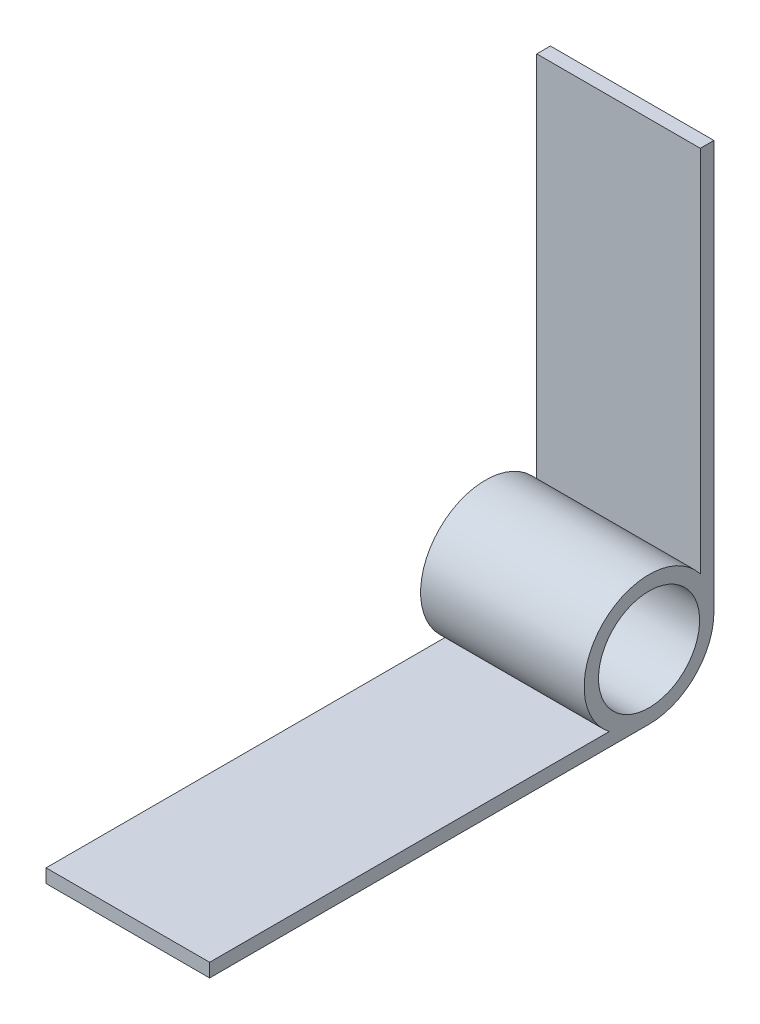
ISO-10303-21;
HEADER;
FILE_DESCRIPTION(('STEP AP214'),'2;1');
FILE_NAME('part.step','',(''),(''),'','','');
FILE_SCHEMA(('AUTOMOTIVE_DESIGN { 1 0 10303 214 1 1 1 1 }'));
ENDSEC;
DATA;
#1=APPLICATION_CONTEXT('core data for automotive mechanical design processes');
#2=APPLICATION_PROTOCOL_DEFINITION('international standard','automotive_design',2000,#1);
#3=PRODUCT_CONTEXT('',#1,'mechanical');
#4=PRODUCT('Part','Part','',(#3));
#5=PRODUCT_RELATED_PRODUCT_CATEGORY('part','',(#4));
#6=PRODUCT_DEFINITION_FORMATION('','',#4);
#7=PRODUCT_DEFINITION_CONTEXT('part definition',#1,'design');
#8=PRODUCT_DEFINITION('design','',#6,#7);
#9=PRODUCT_DEFINITION_SHAPE('','',#8);
#10=(LENGTH_UNIT() NAMED_UNIT(*) SI_UNIT(.MILLI.,.METRE.));
#11=(NAMED_UNIT(*) PLANE_ANGLE_UNIT() SI_UNIT($,.RADIAN.));
#12=(NAMED_UNIT(*) SI_UNIT($,.STERADIAN.) SOLID_ANGLE_UNIT());
#13=UNCERTAINTY_MEASURE_WITH_UNIT(LENGTH_MEASURE(1.E-05),#10,'distance_accuracy_value','');
#14=(GEOMETRIC_REPRESENTATION_CONTEXT(3) GLOBAL_UNCERTAINTY_ASSIGNED_CONTEXT((#13)) GLOBAL_UNIT_ASSIGNED_CONTEXT((#10,
#11,#12)) REPRESENTATION_CONTEXT('',''));
#15=CARTESIAN_POINT('',(0.,0.,0.));
#16=DIRECTION('',(0.,0.,1.));
#17=DIRECTION('',(1.,0.,0.));
#18=AXIS2_PLACEMENT_3D('',#15,#16,#17);
#19=CARTESIAN_POINT('',(7.62,0.,0.));
#20=DIRECTION('',(1.,0.,0.));
#21=DIRECTION('',(0.,0.,-1.));
#22=AXIS2_PLACEMENT_3D('',#19,#20,#21);
#23=PLANE('',#22);
#24=CARTESIAN_POINT('',(7.62,0.,0.));
#25=DIRECTION('',(1.,0.,0.));
#26=DIRECTION('',(0.,0.,-1.));
#27=AXIS2_PLACEMENT_3D('',#24,#25,#26);
#28=CIRCLE('',#27,3.0226);
#29=CARTESIAN_POINT('',(7.62,-3.0226,0.));
#30=VERTEX_POINT('',#29);
#31=CARTESIAN_POINT('',(7.62,0.,-3.0226));
#32=VERTEX_POINT('',#31);
#33=EDGE_CURVE('E149',#30,#32,#28,.T.);
#34=ORIENTED_EDGE('',*,*,#33,.T.);
#35=DIRECTION('',(0.,1.,0.));
#36=VECTOR('',#35,1.);
#37=CARTESIAN_POINT('',(7.62,0.,-3.0226));
#38=LINE('',#37,#36);
#39=CARTESIAN_POINT('',(7.62,19.0246,-3.0226));
#40=VERTEX_POINT('',#39);
#41=EDGE_CURVE('E97',#32,#40,#38,.T.);
#42=ORIENTED_EDGE('',*,*,#41,.T.);
#43=DIRECTION('',(0.,0.,1.));
#44=VECTOR('',#43,1.);
#45=CARTESIAN_POINT('',(7.62,19.0246,-3.0226));
#46=LINE('',#45,#44);
#47=CARTESIAN_POINT('',(7.62,19.0246,-2.3876));
#48=VERTEX_POINT('',#47);
#49=EDGE_CURVE('E164',#40,#48,#46,.T.);
#50=ORIENTED_EDGE('',*,*,#49,.T.);
#51=DIRECTION('',(0.,-1.,0.));
#52=VECTOR('',#51,1.);
#53=CARTESIAN_POINT('',(7.62,19.0246,-2.3876));
#54=LINE('',#53,#52);
#55=CARTESIAN_POINT('',(7.62,1.85350397895445,-2.3876));
#56=VERTEX_POINT('',#55);
#57=EDGE_CURVE('E177',#48,#56,#54,.T.);
#58=ORIENTED_EDGE('',*,*,#57,.T.);
#59=CARTESIAN_POINT('',(7.62,0.,0.));
#60=DIRECTION('',(1.,0.,0.));
#61=DIRECTION('',(0.,0.,-1.));
#62=AXIS2_PLACEMENT_3D('',#59,#60,#61);
#63=CIRCLE('',#62,3.0226);
#64=CARTESIAN_POINT('',(7.62,-2.3876,1.85350397895445));
#65=VERTEX_POINT('',#64);
#66=EDGE_CURVE('E116',#56,#65,#63,.T.);
#67=ORIENTED_EDGE('',*,*,#66,.T.);
#68=DIRECTION('',(0.,0.,1.));
#69=VECTOR('',#68,1.);
#70=CARTESIAN_POINT('',(7.62,-2.3876,20.4724));
#71=LINE('',#70,#69);
#72=CARTESIAN_POINT('',(7.62,-2.3876,20.4724));
#73=VERTEX_POINT('',#72);
#74=EDGE_CURVE('E110',#65,#73,#71,.T.);
#75=ORIENTED_EDGE('',*,*,#74,.T.);
#76=DIRECTION('',(0.,-1.,0.));
#77=VECTOR('',#76,1.);
#78=CARTESIAN_POINT('',(7.62,-3.0226,20.4724));
#79=LINE('',#78,#77);
#80=CARTESIAN_POINT('',(7.62,-3.0226,20.4724));
#81=VERTEX_POINT('',#80);
#82=EDGE_CURVE('E114',#73,#81,#79,.T.);
#83=ORIENTED_EDGE('',*,*,#82,.T.);
#84=DIRECTION('',(0.,0.,-1.));
#85=VECTOR('',#84,1.);
#86=CARTESIAN_POINT('',(7.62,-3.0226,0.));
#87=LINE('',#86,#85);
#88=EDGE_CURVE('E54',#81,#30,#87,.T.);
#89=ORIENTED_EDGE('',*,*,#88,.T.);
#90=EDGE_LOOP('',(#34,#42,#50,#58,#67,#75,#83,#89));
#91=FACE_BOUND('',#90,.T.);
#92=CARTESIAN_POINT('',(7.62,0.,0.));
#93=DIRECTION('',(1.,0.,0.));
#94=DIRECTION('',(0.,0.,-1.));
#95=AXIS2_PLACEMENT_3D('',#92,#93,#94);
#96=CIRCLE('',#95,2.35585);
#97=CARTESIAN_POINT('',(7.62,0.,2.35585));
#98=VERTEX_POINT('',#97);
#99=EDGE_CURVE('E138',#98,#98,#96,.T.);
#100=ORIENTED_EDGE('',*,*,#99,.F.);
#101=EDGE_LOOP('',(#100));
#102=FACE_BOUND('',#101,.T.);
#103=ADVANCED_FACE('F37',(#91,#102),#23,.T.);
#104=CARTESIAN_POINT('',(0.,0.,0.));
#105=DIRECTION('',(1.,0.,0.));
#106=DIRECTION('',(0.,0.,-1.));
#107=AXIS2_PLACEMENT_3D('',#104,#105,#106);
#108=PLANE('',#107);
#109=CARTESIAN_POINT('',(0.,0.,0.));
#110=DIRECTION('',(1.,0.,0.));
#111=DIRECTION('',(0.,0.,-1.));
#112=AXIS2_PLACEMENT_3D('',#109,#110,#111);
#113=CIRCLE('',#112,3.0226);
#114=CARTESIAN_POINT('',(0.,-3.0226,0.));
#115=VERTEX_POINT('',#114);
#116=CARTESIAN_POINT('',(0.,0.,-3.0226));
#117=VERTEX_POINT('',#116);
#118=EDGE_CURVE('E134',#115,#117,#113,.T.);
#119=ORIENTED_EDGE('',*,*,#118,.F.);
#120=DIRECTION('',(0.,0.,-1.));
#121=VECTOR('',#120,1.);
#122=CARTESIAN_POINT('',(0.,-3.0226,0.));
#123=LINE('',#122,#121);
#124=CARTESIAN_POINT('',(0.,-3.0226,20.4724));
#125=VERTEX_POINT('',#124);
#126=EDGE_CURVE('E89',#125,#115,#123,.T.);
#127=ORIENTED_EDGE('',*,*,#126,.F.);
#128=DIRECTION('',(0.,-1.,0.));
#129=VECTOR('',#128,1.);
#130=CARTESIAN_POINT('',(0.,-3.0226,20.4724));
#131=LINE('',#130,#129);
#132=CARTESIAN_POINT('',(0.,-2.3876,20.4724));
#133=VERTEX_POINT('',#132);
#134=EDGE_CURVE('E83',#133,#125,#131,.T.);
#135=ORIENTED_EDGE('',*,*,#134,.F.);
#136=DIRECTION('',(0.,0.,1.));
#137=VECTOR('',#136,1.);
#138=CARTESIAN_POINT('',(0.,-2.3876,20.4724));
#139=LINE('',#138,#137);
#140=CARTESIAN_POINT('',(0.,-2.3876,1.85350397895445));
#141=VERTEX_POINT('',#140);
#142=EDGE_CURVE('E124',#141,#133,#139,.T.);
#143=ORIENTED_EDGE('',*,*,#142,.F.);
#144=CARTESIAN_POINT('',(0.,0.,0.));
#145=DIRECTION('',(1.,0.,0.));
#146=DIRECTION('',(0.,0.,-1.));
#147=AXIS2_PLACEMENT_3D('',#144,#145,#146);
#148=CIRCLE('',#147,3.0226);
#149=CARTESIAN_POINT('',(0.,1.85350397895445,-2.3876));
#150=VERTEX_POINT('',#149);
#151=EDGE_CURVE('E144',#150,#141,#148,.T.);
#152=ORIENTED_EDGE('',*,*,#151,.F.);
#153=DIRECTION('',(0.,-1.,0.));
#154=VECTOR('',#153,1.);
#155=CARTESIAN_POINT('',(0.,19.0246,-2.3876));
#156=LINE('',#155,#154);
#157=CARTESIAN_POINT('',(0.,19.0246,-2.3876));
#158=VERTEX_POINT('',#157);
#159=EDGE_CURVE('E142',#158,#150,#156,.T.);
#160=ORIENTED_EDGE('',*,*,#159,.F.);
#161=DIRECTION('',(0.,0.,1.));
#162=VECTOR('',#161,1.);
#163=CARTESIAN_POINT('',(0.,19.0246,-3.0226));
#164=LINE('',#163,#162);
#165=CARTESIAN_POINT('',(0.,19.0246,-3.0226));
#166=VERTEX_POINT('',#165);
#167=EDGE_CURVE('E140',#166,#158,#164,.T.);
#168=ORIENTED_EDGE('',*,*,#167,.F.);
#169=DIRECTION('',(0.,1.,0.));
#170=VECTOR('',#169,1.);
#171=CARTESIAN_POINT('',(0.,0.,-3.0226));
#172=LINE('',#171,#170);
#173=EDGE_CURVE('E137',#117,#166,#172,.T.);
#174=ORIENTED_EDGE('',*,*,#173,.F.);
#175=EDGE_LOOP('',(#119,#127,#135,#143,#152,#160,#168,#174));
#176=FACE_BOUND('',#175,.T.);
#177=CARTESIAN_POINT('',(0.,0.,0.));
#178=DIRECTION('',(1.,0.,0.));
#179=DIRECTION('',(0.,0.,-1.));
#180=AXIS2_PLACEMENT_3D('',#177,#178,#179);
#181=CIRCLE('',#180,2.35585);
#182=CARTESIAN_POINT('',(0.,0.,2.35585));
#183=VERTEX_POINT('',#182);
#184=EDGE_CURVE('E183',#183,#183,#181,.T.);
#185=ORIENTED_EDGE('',*,*,#184,.T.);
#186=EDGE_LOOP('',(#185));
#187=FACE_BOUND('',#186,.T.);
#188=ADVANCED_FACE('F168',(#176,#187),#108,.F.);
#189=CARTESIAN_POINT('',(7.62,0.,0.));
#190=DIRECTION('',(-1.,0.,0.));
#191=DIRECTION('',(0.,0.,1.));
#192=AXIS2_PLACEMENT_3D('',#189,#190,#191);
#193=CYLINDRICAL_SURFACE('',#192,3.0226);
#194=ORIENTED_EDGE('',*,*,#118,.T.);
#195=DIRECTION('',(-1.,0.,0.));
#196=VECTOR('',#195,1.);
#197=CARTESIAN_POINT('',(7.62,0.,-3.0226));
#198=LINE('',#197,#196);
#199=EDGE_CURVE('E11',#32,#117,#198,.T.);
#200=ORIENTED_EDGE('',*,*,#199,.F.);
#201=ORIENTED_EDGE('',*,*,#33,.F.);
#202=DIRECTION('',(-1.,0.,0.));
#203=VECTOR('',#202,1.);
#204=CARTESIAN_POINT('',(7.62,-3.0226,0.));
#205=LINE('',#204,#203);
#206=EDGE_CURVE('E130',#30,#115,#205,.T.);
#207=ORIENTED_EDGE('',*,*,#206,.T.);
#208=EDGE_LOOP('',(#194,#200,#201,#207));
#209=FACE_BOUND('',#208,.T.);
#210=ADVANCED_FACE('F39',(#209),#193,.T.);
#211=CARTESIAN_POINT('',(7.62,0.,-3.0226));
#212=DIRECTION('',(0.,0.,1.));
#213=DIRECTION('',(0.,-1.,0.));
#214=AXIS2_PLACEMENT_3D('',#211,#212,#213);
#215=PLANE('',#214);
#216=ORIENTED_EDGE('',*,*,#173,.T.);
#217=DIRECTION('',(-1.,0.,0.));
#218=VECTOR('',#217,1.);
#219=CARTESIAN_POINT('',(7.62,19.0246,-3.0226));
#220=LINE('',#219,#218);
#221=EDGE_CURVE('E46',#40,#166,#220,.T.);
#222=ORIENTED_EDGE('',*,*,#221,.F.);
#223=ORIENTED_EDGE('',*,*,#41,.F.);
#224=ORIENTED_EDGE('',*,*,#199,.T.);
#225=EDGE_LOOP('',(#216,#222,#223,#224));
#226=FACE_BOUND('',#225,.T.);
#227=ADVANCED_FACE('F211',(#226),#215,.F.);
#228=CARTESIAN_POINT('',(7.62,19.0246,-3.0226));
#229=DIRECTION('',(0.,-1.,0.));
#230=DIRECTION('',(0.,0.,-1.));
#231=AXIS2_PLACEMENT_3D('',#228,#229,#230);
#232=PLANE('',#231);
#233=ORIENTED_EDGE('',*,*,#167,.T.);
#234=DIRECTION('',(-1.,0.,0.));
#235=VECTOR('',#234,1.);
#236=CARTESIAN_POINT('',(7.62,19.0246,-2.3876));
#237=LINE('',#236,#235);
#238=EDGE_CURVE('E156',#48,#158,#237,.T.);
#239=ORIENTED_EDGE('',*,*,#238,.F.);
#240=ORIENTED_EDGE('',*,*,#49,.F.);
#241=ORIENTED_EDGE('',*,*,#221,.T.);
#242=EDGE_LOOP('',(#233,#239,#240,#241));
#243=FACE_BOUND('',#242,.T.);
#244=ADVANCED_FACE('F162',(#243),#232,.F.);
#245=CARTESIAN_POINT('',(7.62,19.0246,-2.3876));
#246=DIRECTION('',(0.,0.,-1.));
#247=DIRECTION('',(0.,1.,0.));
#248=AXIS2_PLACEMENT_3D('',#245,#246,#247);
#249=PLANE('',#248);
#250=ORIENTED_EDGE('',*,*,#159,.T.);
#251=DIRECTION('',(-1.,0.,0.));
#252=VECTOR('',#251,1.);
#253=CARTESIAN_POINT('',(7.62,1.85350397895445,-2.3876));
#254=LINE('',#253,#252);
#255=EDGE_CURVE('E153',#56,#150,#254,.T.);
#256=ORIENTED_EDGE('',*,*,#255,.F.);
#257=ORIENTED_EDGE('',*,*,#57,.F.);
#258=ORIENTED_EDGE('',*,*,#238,.T.);
#259=EDGE_LOOP('',(#250,#256,#257,#258));
#260=FACE_BOUND('',#259,.T.);
#261=ADVANCED_FACE('F173',(#260),#249,.F.);
#262=CARTESIAN_POINT('',(7.62,0.,0.));
#263=DIRECTION('',(-1.,0.,0.));
#264=DIRECTION('',(0.,0.,1.));
#265=AXIS2_PLACEMENT_3D('',#262,#263,#264);
#266=CYLINDRICAL_SURFACE('',#265,3.0226);
#267=ORIENTED_EDGE('',*,*,#151,.T.);
#268=DIRECTION('',(-1.,0.,0.));
#269=VECTOR('',#268,1.);
#270=CARTESIAN_POINT('',(7.62,-2.3876,1.85350397895445));
#271=LINE('',#270,#269);
#272=EDGE_CURVE('E125',#65,#141,#271,.T.);
#273=ORIENTED_EDGE('',*,*,#272,.F.);
#274=ORIENTED_EDGE('',*,*,#66,.F.);
#275=ORIENTED_EDGE('',*,*,#255,.T.);
#276=EDGE_LOOP('',(#267,#273,#274,#275));
#277=FACE_BOUND('',#276,.T.);
#278=ADVANCED_FACE('F176',(#277),#266,.T.);
#279=CARTESIAN_POINT('',(7.62,-2.3876,20.4724));
#280=DIRECTION('',(0.,-1.,0.));
#281=DIRECTION('',(0.,0.,-1.));
#282=AXIS2_PLACEMENT_3D('',#279,#280,#281);
#283=PLANE('',#282);
#284=ORIENTED_EDGE('',*,*,#142,.T.);
#285=DIRECTION('',(-1.,0.,0.));
#286=VECTOR('',#285,1.);
#287=CARTESIAN_POINT('',(7.62,-2.3876,20.4724));
#288=LINE('',#287,#286);
#289=EDGE_CURVE('E121',#73,#133,#288,.T.);
#290=ORIENTED_EDGE('',*,*,#289,.F.);
#291=ORIENTED_EDGE('',*,*,#74,.F.);
#292=ORIENTED_EDGE('',*,*,#272,.T.);
#293=EDGE_LOOP('',(#284,#290,#291,#292));
#294=FACE_BOUND('',#293,.T.);
#295=ADVANCED_FACE('F122',(#294),#283,.F.);
#296=CARTESIAN_POINT('',(7.62,-3.0226,20.4724));
#297=DIRECTION('',(0.,0.,-1.));
#298=DIRECTION('',(-1.,0.,0.));
#299=AXIS2_PLACEMENT_3D('',#296,#297,#298);
#300=PLANE('',#299);
#301=ORIENTED_EDGE('',*,*,#134,.T.);
#302=DIRECTION('',(-1.,0.,0.));
#303=VECTOR('',#302,1.);
#304=CARTESIAN_POINT('',(7.62,-3.0226,20.4724));
#305=LINE('',#304,#303);
#306=EDGE_CURVE('E126',#81,#125,#305,.T.);
#307=ORIENTED_EDGE('',*,*,#306,.F.);
#308=ORIENTED_EDGE('',*,*,#82,.F.);
#309=ORIENTED_EDGE('',*,*,#289,.T.);
#310=EDGE_LOOP('',(#301,#307,#308,#309));
#311=FACE_BOUND('',#310,.T.);
#312=ADVANCED_FACE('F128',(#311),#300,.F.);
#313=CARTESIAN_POINT('',(7.62,-3.0226,0.));
#314=DIRECTION('',(0.,1.,0.));
#315=DIRECTION('',(0.,0.,1.));
#316=AXIS2_PLACEMENT_3D('',#313,#314,#315);
#317=PLANE('',#316);
#318=ORIENTED_EDGE('',*,*,#126,.T.);
#319=ORIENTED_EDGE('',*,*,#206,.F.);
#320=ORIENTED_EDGE('',*,*,#88,.F.);
#321=ORIENTED_EDGE('',*,*,#306,.T.);
#322=EDGE_LOOP('',(#318,#319,#320,#321));
#323=FACE_BOUND('',#322,.T.);
#324=ADVANCED_FACE('F199',(#323),#317,.F.);
#325=CARTESIAN_POINT('',(7.62,0.,0.));
#326=DIRECTION('',(-1.,0.,0.));
#327=DIRECTION('',(0.,0.,1.));
#328=AXIS2_PLACEMENT_3D('',#325,#326,#327);
#329=CYLINDRICAL_SURFACE('',#328,2.35585);
#330=CARTESIAN_POINT('',(7.62,0.,2.35585));
#331=CARTESIAN_POINT('',(7.540625,0.,2.35585));
#332=CARTESIAN_POINT('',(7.46125,0.,2.35585));
#333=CARTESIAN_POINT('',(7.3025,0.,2.35585));
#334=CARTESIAN_POINT('',(7.223125,0.,2.35585));
#335=CARTESIAN_POINT('',(7.064375,0.,2.35585));
#336=CARTESIAN_POINT('',(6.985,0.,2.35585));
#337=CARTESIAN_POINT('',(6.82625,0.,2.35585));
#338=CARTESIAN_POINT('',(6.746875,0.,2.35585));
#339=CARTESIAN_POINT('',(6.588125,0.,2.35585));
#340=CARTESIAN_POINT('',(6.50875,0.,2.35585));
#341=CARTESIAN_POINT('',(6.35,0.,2.35585));
#342=CARTESIAN_POINT('',(6.270625,0.,2.35585));
#343=CARTESIAN_POINT('',(6.111875,0.,2.35585));
#344=CARTESIAN_POINT('',(6.0325,0.,2.35585));
#345=CARTESIAN_POINT('',(5.87375,0.,2.35585));
#346=CARTESIAN_POINT('',(5.794375,0.,2.35585));
#347=CARTESIAN_POINT('',(5.635625,0.,2.35585));
#348=CARTESIAN_POINT('',(5.55625,0.,2.35585));
#349=CARTESIAN_POINT('',(5.3975,0.,2.35585));
#350=CARTESIAN_POINT('',(5.318125,0.,2.35585));
#351=CARTESIAN_POINT('',(5.159375,0.,2.35585));
#352=CARTESIAN_POINT('',(5.08,0.,2.35585));
#353=CARTESIAN_POINT('',(4.92125,0.,2.35585));
#354=CARTESIAN_POINT('',(4.841875,0.,2.35585));
#355=CARTESIAN_POINT('',(4.683125,0.,2.35585));
#356=CARTESIAN_POINT('',(4.60375,0.,2.35585));
#357=CARTESIAN_POINT('',(4.445,0.,2.35585));
#358=CARTESIAN_POINT('',(4.365625,0.,2.35585));
#359=CARTESIAN_POINT('',(4.206875,0.,2.35585));
#360=CARTESIAN_POINT('',(4.1275,0.,2.35585));
#361=CARTESIAN_POINT('',(3.96875,0.,2.35585));
#362=CARTESIAN_POINT('',(3.889375,0.,2.35585));
#363=CARTESIAN_POINT('',(3.730625,0.,2.35585));
#364=CARTESIAN_POINT('',(3.65125,0.,2.35585));
#365=CARTESIAN_POINT('',(3.4925,0.,2.35585));
#366=CARTESIAN_POINT('',(3.413125,0.,2.35585));
#367=CARTESIAN_POINT('',(3.254375,0.,2.35585));
#368=CARTESIAN_POINT('',(3.175,0.,2.35585));
#369=CARTESIAN_POINT('',(3.01625,0.,2.35585));
#370=CARTESIAN_POINT('',(2.936875,0.,2.35585));
#371=CARTESIAN_POINT('',(2.778125,0.,2.35585));
#372=CARTESIAN_POINT('',(2.69875,0.,2.35585));
#373=CARTESIAN_POINT('',(2.54,0.,2.35585));
#374=CARTESIAN_POINT('',(2.460625,0.,2.35585));
#375=CARTESIAN_POINT('',(2.301875,0.,2.35585));
#376=CARTESIAN_POINT('',(2.2225,0.,2.35585));
#377=CARTESIAN_POINT('',(2.06375,0.,2.35585));
#378=CARTESIAN_POINT('',(1.984375,0.,2.35585));
#379=CARTESIAN_POINT('',(1.825625,0.,2.35585));
#380=CARTESIAN_POINT('',(1.74625,0.,2.35585));
#381=CARTESIAN_POINT('',(1.5875,0.,2.35585));
#382=CARTESIAN_POINT('',(1.508125,0.,2.35585));
#383=CARTESIAN_POINT('',(1.349375,0.,2.35585));
#384=CARTESIAN_POINT('',(1.27,0.,2.35585));
#385=CARTESIAN_POINT('',(1.11125,0.,2.35585));
#386=CARTESIAN_POINT('',(1.031875,0.,2.35585));
#387=CARTESIAN_POINT('',(0.873125,0.,2.35585));
#388=CARTESIAN_POINT('',(0.79375,0.,2.35585));
#389=CARTESIAN_POINT('',(0.635,0.,2.35585));
#390=CARTESIAN_POINT('',(0.555625,0.,2.35585));
#391=CARTESIAN_POINT('',(0.396875,0.,2.35585));
#392=CARTESIAN_POINT('',(0.3175,0.,2.35585));
#393=CARTESIAN_POINT('',(0.15875,0.,2.35585));
#394=CARTESIAN_POINT('',(0.0793749999999999,0.,2.35585));
#395=CARTESIAN_POINT('',(0.,0.,2.35585));
#396=B_SPLINE_CURVE_WITH_KNOTS('',3,(#330,#331,#332,#333,#334,#335,#336,#337,#338,#339,#340,
#341,#342,#343,#344,#345,#346,#347,#348,#349,#350,#351,#352,#353,#354,#355,#356,#357,#358,#359,
#360,#361,#362,#363,#364,#365,#366,#367,#368,#369,#370,#371,#372,#373,#374,#375,#376,#377,#378,
#379,#380,#381,#382,#383,#384,#385,#386,#387,#388,#389,#390,#391,#392,#393,#394,#395),
.UNSPECIFIED.,.F.,.F.,(4,2,2,2,2,2,2,2,2,2,2,2,2,2,2,2,2,2,2,2,2,2,2,2,2,2,2,2,2,2,2,2,4),(0.,
0.238125,0.47625,0.714375000000001,0.9525,1.190625,1.42875,1.666875,1.905,2.143125,2.38125,
2.619375,2.8575,3.095625,3.33375,3.571875,3.81,4.048125,4.28625,4.524375,4.7625,5.000625,
5.23875,5.476875,5.715,5.953125,6.19125,6.429375,6.6675,6.905625,7.14375,7.381875,7.62),.UNSPECIFIED.);
#397=EDGE_CURVE('BSEAM189',#98,#183,#396,.T.);
#398=ORIENTED_EDGE('',*,*,#99,.T.);
#399=ORIENTED_EDGE('',*,*,#184,.F.);
#400=ORIENTED_EDGE('',*,*,#397,.T.);
#401=ORIENTED_EDGE('',*,*,#397,.F.);
#402=EDGE_LOOP('',(#398,#400,#399,#401));
#403=FACE_BOUND('',#402,.T.);
#404=ADVANCED_FACE('F189',(#403),#329,.F.);
#405=CLOSED_SHELL('',(#103,#188,#210,#227,#244,#261,#278,#295,#312,#324,#404));
#406=MANIFOLD_SOLID_BREP('B2',#405);
#407=ADVANCED_BREP_SHAPE_REPRESENTATION('',(#18,#406),#14);
#408=SHAPE_DEFINITION_REPRESENTATION(#9,#407);
ENDSEC;
END-ISO-10303-21;
